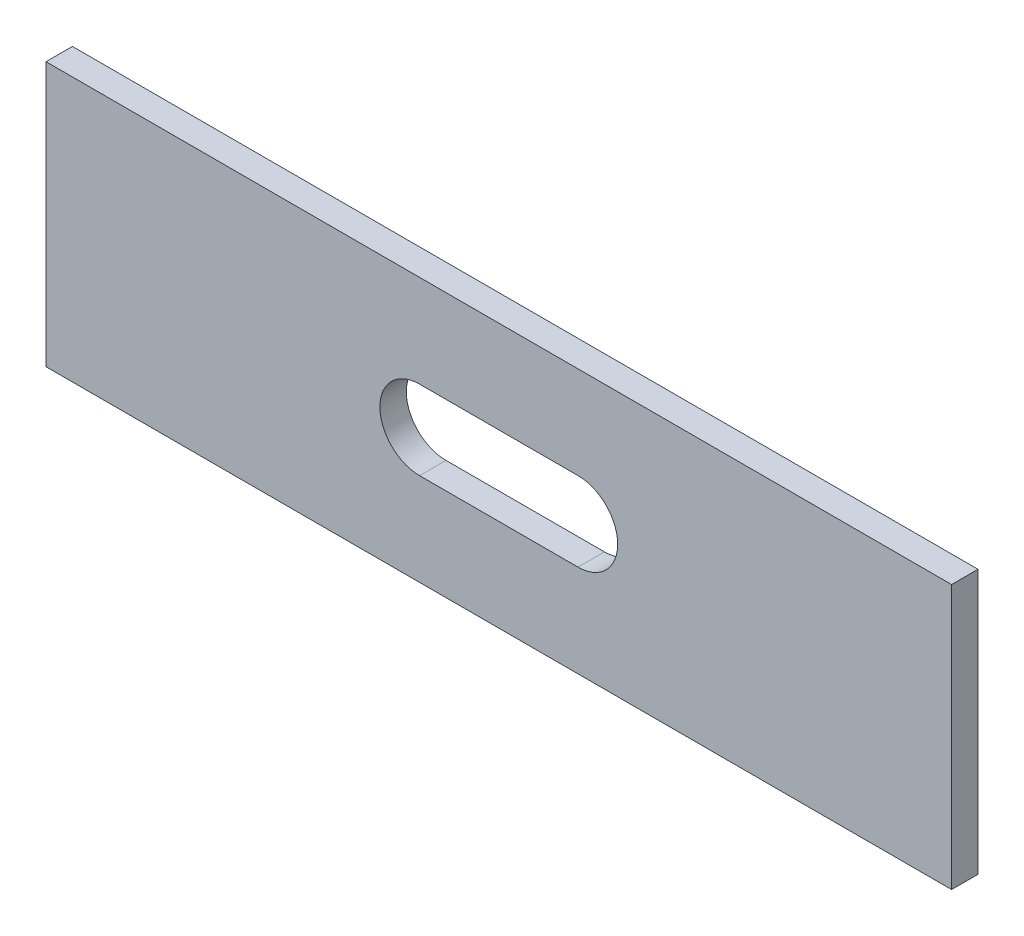
ISO-10303-21;
HEADER;
FILE_DESCRIPTION(('STEP AP214'),'2;1');
FILE_NAME('part.step','',(''),(''),'','','');
FILE_SCHEMA(('AUTOMOTIVE_DESIGN { 1 0 10303 214 1 1 1 1 }'));
ENDSEC;
DATA;
#1=APPLICATION_CONTEXT('core data for automotive mechanical design processes');
#2=APPLICATION_PROTOCOL_DEFINITION('international standard','automotive_design',2000,#1);
#3=PRODUCT_CONTEXT('',#1,'mechanical');
#4=PRODUCT('Part','Part','',(#3));
#5=PRODUCT_RELATED_PRODUCT_CATEGORY('part','',(#4));
#6=PRODUCT_DEFINITION_FORMATION('','',#4);
#7=PRODUCT_DEFINITION_CONTEXT('part definition',#1,'design');
#8=PRODUCT_DEFINITION('design','',#6,#7);
#9=PRODUCT_DEFINITION_SHAPE('','',#8);
#10=(LENGTH_UNIT() NAMED_UNIT(*) SI_UNIT(.MILLI.,.METRE.));
#11=(NAMED_UNIT(*) PLANE_ANGLE_UNIT() SI_UNIT($,.RADIAN.));
#12=(NAMED_UNIT(*) SI_UNIT($,.STERADIAN.) SOLID_ANGLE_UNIT());
#13=UNCERTAINTY_MEASURE_WITH_UNIT(LENGTH_MEASURE(1.E-05),#10,'distance_accuracy_value','');
#14=(GEOMETRIC_REPRESENTATION_CONTEXT(3) GLOBAL_UNCERTAINTY_ASSIGNED_CONTEXT((#13)) GLOBAL_UNIT_ASSIGNED_CONTEXT((#10,
#11,#12)) REPRESENTATION_CONTEXT('',''));
#15=CARTESIAN_POINT('',(0.,0.,0.));
#16=DIRECTION('',(0.,0.,1.));
#17=DIRECTION('',(1.,0.,0.));
#18=AXIS2_PLACEMENT_3D('',#15,#16,#17);
#19=CARTESIAN_POINT('',(0.,0.,0.));
#20=DIRECTION('',(0.,0.,-1.));
#21=DIRECTION('',(-1.,0.,0.));
#22=AXIS2_PLACEMENT_3D('',#19,#20,#21);
#23=PLANE('',#22);
#24=CARTESIAN_POINT('',(-102.489,0.,0.));
#25=DIRECTION('',(0.,0.,-1.));
#26=DIRECTION('',(-1.,0.,0.));
#27=AXIS2_PLACEMENT_3D('',#24,#25,#26);
#28=CIRCLE('',#27,4.69899999999999);
#29=CARTESIAN_POINT('',(-107.188,0.,0.));
#30=VERTEX_POINT('',#29);
#31=EDGE_CURVE('E212',#30,#30,#28,.F.);
#32=ORIENTED_EDGE('',*,*,#31,.T.);
#33=EDGE_LOOP('',(#32));
#34=FACE_BOUND('',#33,.T.);
#35=CARTESIAN_POINT('',(19.05,0.,0.));
#36=DIRECTION('',(0.,0.,1.));
#37=DIRECTION('',(1.,0.,0.));
#38=AXIS2_PLACEMENT_3D('',#35,#36,#37);
#39=CIRCLE('',#38,9.525);
#40=CARTESIAN_POINT('',(19.05,-9.52499999999999,0.));
#41=VERTEX_POINT('',#40);
#42=CARTESIAN_POINT('',(19.05,9.52500000000001,0.));
#43=VERTEX_POINT('',#42);
#44=EDGE_CURVE('E209',#41,#43,#39,.T.);
#45=ORIENTED_EDGE('',*,*,#44,.T.);
#46=DIRECTION('',(-1.,0.,0.));
#47=VECTOR('',#46,1.);
#48=CARTESIAN_POINT('',(19.05,9.52500000000001,0.));
#49=LINE('',#48,#47);
#50=CARTESIAN_POINT('',(-19.05,9.525,0.));
#51=VERTEX_POINT('',#50);
#52=EDGE_CURVE('E221',#43,#51,#49,.T.);
#53=ORIENTED_EDGE('',*,*,#52,.T.);
#54=CARTESIAN_POINT('',(-19.05,0.,0.));
#55=DIRECTION('',(0.,0.,1.));
#56=DIRECTION('',(1.,0.,0.));
#57=AXIS2_PLACEMENT_3D('',#54,#55,#56);
#58=CIRCLE('',#57,9.525);
#59=CARTESIAN_POINT('',(-19.05,-9.52500000000001,0.));
#60=VERTEX_POINT('',#59);
#61=EDGE_CURVE('E66',#51,#60,#58,.T.);
#62=ORIENTED_EDGE('',*,*,#61,.T.);
#63=DIRECTION('',(1.,0.,0.));
#64=VECTOR('',#63,1.);
#65=CARTESIAN_POINT('',(19.05,-9.52499999999999,0.));
#66=LINE('',#65,#64);
#67=EDGE_CURVE('E185',#60,#41,#66,.T.);
#68=ORIENTED_EDGE('',*,*,#67,.T.);
#69=EDGE_LOOP('',(#45,#53,#62,#68));
#70=FACE_BOUND('',#69,.T.);
#71=DIRECTION('',(0.,1.,0.));
#72=VECTOR('',#71,1.);
#73=CARTESIAN_POINT('',(108.839,-31.7499999999999,0.));
#74=LINE('',#73,#72);
#75=CARTESIAN_POINT('',(108.839,-31.7499999999999,0.));
#76=VERTEX_POINT('',#75);
#77=CARTESIAN_POINT('',(108.839,31.7499999999999,0.));
#78=VERTEX_POINT('',#77);
#79=EDGE_CURVE('E146',#76,#78,#74,.T.);
#80=ORIENTED_EDGE('',*,*,#79,.F.);
#81=DIRECTION('',(1.,0.,0.));
#82=VECTOR('',#81,1.);
#83=CARTESIAN_POINT('',(-108.839,-31.75,0.));
#84=LINE('',#83,#82);
#85=CARTESIAN_POINT('',(-108.839,-31.75,0.));
#86=VERTEX_POINT('',#85);
#87=EDGE_CURVE('E111',#86,#76,#84,.T.);
#88=ORIENTED_EDGE('',*,*,#87,.F.);
#89=DIRECTION('',(0.,-1.,0.));
#90=VECTOR('',#89,1.);
#91=CARTESIAN_POINT('',(-108.839,-31.75,0.));
#92=LINE('',#91,#90);
#93=CARTESIAN_POINT('',(-108.839,31.7499999999999,0.));
#94=VERTEX_POINT('',#93);
#95=EDGE_CURVE('E104',#94,#86,#92,.T.);
#96=ORIENTED_EDGE('',*,*,#95,.F.);
#97=DIRECTION('',(-1.,0.,0.));
#98=VECTOR('',#97,1.);
#99=CARTESIAN_POINT('',(-108.839,31.7499999999999,0.));
#100=LINE('',#99,#98);
#101=EDGE_CURVE('E96',#78,#94,#100,.T.);
#102=ORIENTED_EDGE('',*,*,#101,.F.);
#103=EDGE_LOOP('',(#80,#88,#96,#102));
#104=FACE_BOUND('',#103,.T.);
#105=CARTESIAN_POINT('',(102.489,0.,0.));
#106=DIRECTION('',(0.,0.,-1.));
#107=DIRECTION('',(-1.,0.,0.));
#108=AXIS2_PLACEMENT_3D('',#105,#106,#107);
#109=CIRCLE('',#108,4.69899999999999);
#110=CARTESIAN_POINT('',(97.79,0.,0.));
#111=VERTEX_POINT('',#110);
#112=EDGE_CURVE('E200',#111,#111,#109,.T.);
#113=ORIENTED_EDGE('',*,*,#112,.F.);
#114=EDGE_LOOP('',(#113));
#115=FACE_BOUND('',#114,.T.);
#116=ADVANCED_FACE('F39',(#34,#70,#104,#115),#23,.T.);
#117=CARTESIAN_POINT('',(108.839,-31.7499999999999,6.35));
#118=DIRECTION('',(-1.,0.,0.));
#119=DIRECTION('',(0.,0.,1.));
#120=AXIS2_PLACEMENT_3D('',#117,#118,#119);
#121=PLANE('',#120);
#122=ORIENTED_EDGE('',*,*,#79,.T.);
#123=DIRECTION('',(0.,0.,-1.));
#124=VECTOR('',#123,1.);
#125=CARTESIAN_POINT('',(108.839,31.7499999999999,6.35));
#126=LINE('',#125,#124);
#127=CARTESIAN_POINT('',(108.839,31.7499999999999,6.35));
#128=VERTEX_POINT('',#127);
#129=EDGE_CURVE('E11',#128,#78,#126,.T.);
#130=ORIENTED_EDGE('',*,*,#129,.F.);
#131=DIRECTION('',(0.,1.,0.));
#132=VECTOR('',#131,1.);
#133=CARTESIAN_POINT('',(108.839,-31.7499999999999,6.35));
#134=LINE('',#133,#132);
#135=CARTESIAN_POINT('',(108.839,-31.7499999999999,6.35));
#136=VERTEX_POINT('',#135);
#137=EDGE_CURVE('E155',#136,#128,#134,.T.);
#138=ORIENTED_EDGE('',*,*,#137,.F.);
#139=DIRECTION('',(0.,0.,-1.));
#140=VECTOR('',#139,1.);
#141=CARTESIAN_POINT('',(108.839,-31.7499999999999,6.35));
#142=LINE('',#141,#140);
#143=EDGE_CURVE('E136',#136,#76,#142,.T.);
#144=ORIENTED_EDGE('',*,*,#143,.T.);
#145=EDGE_LOOP('',(#122,#130,#138,#144));
#146=FACE_BOUND('',#145,.T.);
#147=ADVANCED_FACE('F41',(#146),#121,.F.);
#148=CARTESIAN_POINT('',(-108.839,31.7499999999999,6.35));
#149=DIRECTION('',(0.,-1.,0.));
#150=DIRECTION('',(1.,0.,0.));
#151=AXIS2_PLACEMENT_3D('',#148,#149,#150);
#152=PLANE('',#151);
#153=ORIENTED_EDGE('',*,*,#101,.T.);
#154=DIRECTION('',(0.,0.,-1.));
#155=VECTOR('',#154,1.);
#156=CARTESIAN_POINT('',(-108.839,31.7499999999999,6.35));
#157=LINE('',#156,#155);
#158=CARTESIAN_POINT('',(-108.839,31.7499999999999,6.35));
#159=VERTEX_POINT('',#158);
#160=EDGE_CURVE('E49',#159,#94,#157,.T.);
#161=ORIENTED_EDGE('',*,*,#160,.F.);
#162=DIRECTION('',(-1.,0.,0.));
#163=VECTOR('',#162,1.);
#164=CARTESIAN_POINT('',(-108.839,31.7499999999999,6.35));
#165=LINE('',#164,#163);
#166=EDGE_CURVE('E119',#128,#159,#165,.T.);
#167=ORIENTED_EDGE('',*,*,#166,.F.);
#168=ORIENTED_EDGE('',*,*,#129,.T.);
#169=EDGE_LOOP('',(#153,#161,#167,#168));
#170=FACE_BOUND('',#169,.T.);
#171=ADVANCED_FACE('F193',(#170),#152,.F.);
#172=CARTESIAN_POINT('',(-108.839,-31.75,6.35));
#173=DIRECTION('',(1.,0.,0.));
#174=DIRECTION('',(0.,1.,0.));
#175=AXIS2_PLACEMENT_3D('',#172,#173,#174);
#176=PLANE('',#175);
#177=ORIENTED_EDGE('',*,*,#95,.T.);
#178=DIRECTION('',(0.,0.,-1.));
#179=VECTOR('',#178,1.);
#180=CARTESIAN_POINT('',(-108.839,-31.75,6.35));
#181=LINE('',#180,#179);
#182=CARTESIAN_POINT('',(-108.839,-31.75,6.35));
#183=VERTEX_POINT('',#182);
#184=EDGE_CURVE('E133',#183,#86,#181,.T.);
#185=ORIENTED_EDGE('',*,*,#184,.F.);
#186=DIRECTION('',(0.,-1.,0.));
#187=VECTOR('',#186,1.);
#188=CARTESIAN_POINT('',(-108.839,-31.75,6.35));
#189=LINE('',#188,#187);
#190=EDGE_CURVE('E127',#159,#183,#189,.T.);
#191=ORIENTED_EDGE('',*,*,#190,.F.);
#192=ORIENTED_EDGE('',*,*,#160,.T.);
#193=EDGE_LOOP('',(#177,#185,#191,#192));
#194=FACE_BOUND('',#193,.T.);
#195=ADVANCED_FACE('F134',(#194),#176,.F.);
#196=CARTESIAN_POINT('',(-108.839,-31.75,6.35));
#197=DIRECTION('',(0.,1.,0.));
#198=DIRECTION('',(-1.,0.,0.));
#199=AXIS2_PLACEMENT_3D('',#196,#197,#198);
#200=PLANE('',#199);
#201=ORIENTED_EDGE('',*,*,#87,.T.);
#202=ORIENTED_EDGE('',*,*,#143,.F.);
#203=DIRECTION('',(1.,0.,0.));
#204=VECTOR('',#203,1.);
#205=CARTESIAN_POINT('',(-108.839,-31.75,6.35));
#206=LINE('',#205,#204);
#207=EDGE_CURVE('E130',#183,#136,#206,.T.);
#208=ORIENTED_EDGE('',*,*,#207,.F.);
#209=ORIENTED_EDGE('',*,*,#184,.T.);
#210=EDGE_LOOP('',(#201,#202,#208,#209));
#211=FACE_BOUND('',#210,.T.);
#212=ADVANCED_FACE('F138',(#211),#200,.F.);
#213=CARTESIAN_POINT('',(0.,0.,6.35));
#214=DIRECTION('',(0.,0.,-1.));
#215=DIRECTION('',(-1.,0.,0.));
#216=AXIS2_PLACEMENT_3D('',#213,#214,#215);
#217=PLANE('',#216);
#218=DIRECTION('',(-1.,0.,0.));
#219=VECTOR('',#218,1.);
#220=CARTESIAN_POINT('',(19.05,9.52500000000001,6.35));
#221=LINE('',#220,#219);
#222=CARTESIAN_POINT('',(19.05,9.52500000000001,6.35));
#223=VERTEX_POINT('',#222);
#224=CARTESIAN_POINT('',(-19.05,9.525,6.35));
#225=VERTEX_POINT('',#224);
#226=EDGE_CURVE('E159',#223,#225,#221,.T.);
#227=ORIENTED_EDGE('',*,*,#226,.F.);
#228=CARTESIAN_POINT('',(19.05,0.,6.35));
#229=DIRECTION('',(0.,0.,1.));
#230=DIRECTION('',(1.,0.,0.));
#231=AXIS2_PLACEMENT_3D('',#228,#229,#230);
#232=CIRCLE('',#231,9.525);
#233=CARTESIAN_POINT('',(19.05,-9.52499999999999,6.35));
#234=VERTEX_POINT('',#233);
#235=EDGE_CURVE('E43',#234,#223,#232,.T.);
#236=ORIENTED_EDGE('',*,*,#235,.F.);
#237=DIRECTION('',(1.,0.,0.));
#238=VECTOR('',#237,1.);
#239=CARTESIAN_POINT('',(19.05,-9.52499999999999,6.35));
#240=LINE('',#239,#238);
#241=CARTESIAN_POINT('',(-19.05,-9.52500000000001,6.35));
#242=VERTEX_POINT('',#241);
#243=EDGE_CURVE('E87',#242,#234,#240,.T.);
#244=ORIENTED_EDGE('',*,*,#243,.F.);
#245=CARTESIAN_POINT('',(-19.05,0.,6.35));
#246=DIRECTION('',(0.,0.,1.));
#247=DIRECTION('',(1.,0.,0.));
#248=AXIS2_PLACEMENT_3D('',#245,#246,#247);
#249=CIRCLE('',#248,9.525);
#250=EDGE_CURVE('E162',#225,#242,#249,.T.);
#251=ORIENTED_EDGE('',*,*,#250,.F.);
#252=EDGE_LOOP('',(#227,#236,#244,#251));
#253=FACE_BOUND('',#252,.T.);
#254=ORIENTED_EDGE('',*,*,#137,.T.);
#255=ORIENTED_EDGE('',*,*,#166,.T.);
#256=ORIENTED_EDGE('',*,*,#190,.T.);
#257=ORIENTED_EDGE('',*,*,#207,.T.);
#258=EDGE_LOOP('',(#254,#255,#256,#257));
#259=FACE_BOUND('',#258,.T.);
#260=ADVANCED_FACE('F128',(#253,#259),#217,.F.);
#261=CARTESIAN_POINT('',(19.05,0.,0.));
#262=DIRECTION('',(0.,0.,1.));
#263=DIRECTION('',(1.,0.,0.));
#264=AXIS2_PLACEMENT_3D('',#261,#262,#263);
#265=CYLINDRICAL_SURFACE('',#264,9.525);
#266=DIRECTION('',(0.,0.,1.));
#267=VECTOR('',#266,1.);
#268=CARTESIAN_POINT('',(19.05,9.52500000000001,0.));
#269=LINE('',#268,#267);
#270=EDGE_CURVE('E57',#43,#223,#269,.T.);
#271=ORIENTED_EDGE('',*,*,#270,.F.);
#272=ORIENTED_EDGE('',*,*,#44,.F.);
#273=DIRECTION('',(0.,0.,1.));
#274=VECTOR('',#273,1.);
#275=CARTESIAN_POINT('',(19.05,-9.52499999999999,0.));
#276=LINE('',#275,#274);
#277=EDGE_CURVE('E163',#41,#234,#276,.T.);
#278=ORIENTED_EDGE('',*,*,#277,.T.);
#279=ORIENTED_EDGE('',*,*,#235,.T.);
#280=EDGE_LOOP('',(#271,#272,#278,#279));
#281=FACE_BOUND('',#280,.T.);
#282=ADVANCED_FACE('F170',(#281),#265,.F.);
#283=CARTESIAN_POINT('',(19.05,-9.52499999999999,0.));
#284=DIRECTION('',(0.,-1.,0.));
#285=DIRECTION('',(1.,0.,0.));
#286=AXIS2_PLACEMENT_3D('',#283,#284,#285);
#287=PLANE('',#286);
#288=ORIENTED_EDGE('',*,*,#277,.F.);
#289=ORIENTED_EDGE('',*,*,#67,.F.);
#290=DIRECTION('',(0.,0.,1.));
#291=VECTOR('',#290,1.);
#292=CARTESIAN_POINT('',(-19.05,-9.52500000000001,0.));
#293=LINE('',#292,#291);
#294=EDGE_CURVE('E180',#60,#242,#293,.T.);
#295=ORIENTED_EDGE('',*,*,#294,.T.);
#296=ORIENTED_EDGE('',*,*,#243,.T.);
#297=EDGE_LOOP('',(#288,#289,#295,#296));
#298=FACE_BOUND('',#297,.T.);
#299=ADVANCED_FACE('F232',(#298),#287,.F.);
#300=CARTESIAN_POINT('',(-19.05,0.,0.));
#301=DIRECTION('',(0.,0.,1.));
#302=DIRECTION('',(1.,0.,0.));
#303=AXIS2_PLACEMENT_3D('',#300,#301,#302);
#304=CYLINDRICAL_SURFACE('',#303,9.525);
#305=ORIENTED_EDGE('',*,*,#294,.F.);
#306=ORIENTED_EDGE('',*,*,#61,.F.);
#307=DIRECTION('',(0.,0.,1.));
#308=VECTOR('',#307,1.);
#309=CARTESIAN_POINT('',(-19.05,9.525,0.));
#310=LINE('',#309,#308);
#311=EDGE_CURVE('E176',#51,#225,#310,.T.);
#312=ORIENTED_EDGE('',*,*,#311,.T.);
#313=ORIENTED_EDGE('',*,*,#250,.T.);
#314=EDGE_LOOP('',(#305,#306,#312,#313));
#315=FACE_BOUND('',#314,.T.);
#316=ADVANCED_FACE('F178',(#315),#304,.F.);
#317=CARTESIAN_POINT('',(19.05,9.52500000000001,0.));
#318=DIRECTION('',(0.,1.,0.));
#319=DIRECTION('',(-1.,0.,0.));
#320=AXIS2_PLACEMENT_3D('',#317,#318,#319);
#321=PLANE('',#320);
#322=ORIENTED_EDGE('',*,*,#311,.F.);
#323=ORIENTED_EDGE('',*,*,#52,.F.);
#324=ORIENTED_EDGE('',*,*,#270,.T.);
#325=ORIENTED_EDGE('',*,*,#226,.T.);
#326=EDGE_LOOP('',(#322,#323,#324,#325));
#327=FACE_BOUND('',#326,.T.);
#328=ADVANCED_FACE('F175',(#327),#321,.F.);
#329=CARTESIAN_POINT('',(-102.489,0.,5.842));
#330=DIRECTION('',(0.,0.,-1.));
#331=DIRECTION('',(-1.,0.,0.));
#332=AXIS2_PLACEMENT_3D('',#329,#330,#331);
#333=CYLINDRICAL_SURFACE('',#332,4.69899999999999);
#334=CARTESIAN_POINT('',(-102.489,0.,5.842));
#335=DIRECTION('',(0.,0.,-1.));
#336=DIRECTION('',(-1.,0.,0.));
#337=AXIS2_PLACEMENT_3D('',#334,#335,#336);
#338=CIRCLE('',#337,4.69899999999999);
#339=CARTESIAN_POINT('',(-107.188,0.,5.842));
#340=VERTEX_POINT('',#339);
#341=EDGE_CURVE('E204',#340,#340,#338,.F.);
#342=ORIENTED_EDGE('',*,*,#341,.T.);
#343=EDGE_LOOP('',(#342));
#344=FACE_BOUND('',#343,.T.);
#345=ORIENTED_EDGE('',*,*,#31,.F.);
#346=EDGE_LOOP('',(#345));
#347=FACE_BOUND('',#346,.T.);
#348=ADVANCED_FACE('F243',(#344,#347),#333,.F.);
#349=CARTESIAN_POINT('',(0.,0.,5.842));
#350=DIRECTION('',(0.,0.,-1.));
#351=DIRECTION('',(-1.,0.,0.));
#352=AXIS2_PLACEMENT_3D('',#349,#350,#351);
#353=PLANE('',#352);
#354=ORIENTED_EDGE('',*,*,#341,.F.);
#355=EDGE_LOOP('',(#354));
#356=FACE_BOUND('',#355,.T.);
#357=ADVANCED_FACE('F276',(#356),#353,.T.);
#358=CARTESIAN_POINT('',(102.489,0.,5.842));
#359=DIRECTION('',(0.,0.,-1.));
#360=DIRECTION('',(-1.,0.,0.));
#361=AXIS2_PLACEMENT_3D('',#358,#359,#360);
#362=CYLINDRICAL_SURFACE('',#361,4.69899999999999);
#363=CARTESIAN_POINT('',(102.489,0.,5.842));
#364=DIRECTION('',(0.,0.,-1.));
#365=DIRECTION('',(-1.,0.,0.));
#366=AXIS2_PLACEMENT_3D('',#363,#364,#365);
#367=CIRCLE('',#366,4.69899999999999);
#368=CARTESIAN_POINT('',(97.79,0.,5.842));
#369=VERTEX_POINT('',#368);
#370=EDGE_CURVE('E203',#369,#369,#367,.T.);
#371=ORIENTED_EDGE('',*,*,#370,.F.);
#372=EDGE_LOOP('',(#371));
#373=FACE_BOUND('',#372,.T.);
#374=ORIENTED_EDGE('',*,*,#112,.T.);
#375=EDGE_LOOP('',(#374));
#376=FACE_BOUND('',#375,.T.);
#377=ADVANCED_FACE('F285',(#373,#376),#362,.F.);
#378=CARTESIAN_POINT('',(0.,0.,5.842));
#379=DIRECTION('',(0.,0.,-1.));
#380=DIRECTION('',(-1.,0.,0.));
#381=AXIS2_PLACEMENT_3D('',#378,#379,#380);
#382=PLANE('',#381);
#383=ORIENTED_EDGE('',*,*,#370,.T.);
#384=EDGE_LOOP('',(#383));
#385=FACE_BOUND('',#384,.T.);
#386=ADVANCED_FACE('F294',(#385),#382,.T.);
#387=CLOSED_SHELL('',(#116,#147,#171,#195,#212,#260,#282,#299,#316,#328,#348,#357,#377,#386));
#388=MANIFOLD_SOLID_BREP('B2',#387);
#389=ADVANCED_BREP_SHAPE_REPRESENTATION('',(#18,#388),#14);
#390=SHAPE_DEFINITION_REPRESENTATION(#9,#389);
ENDSEC;
END-ISO-10303-21;
